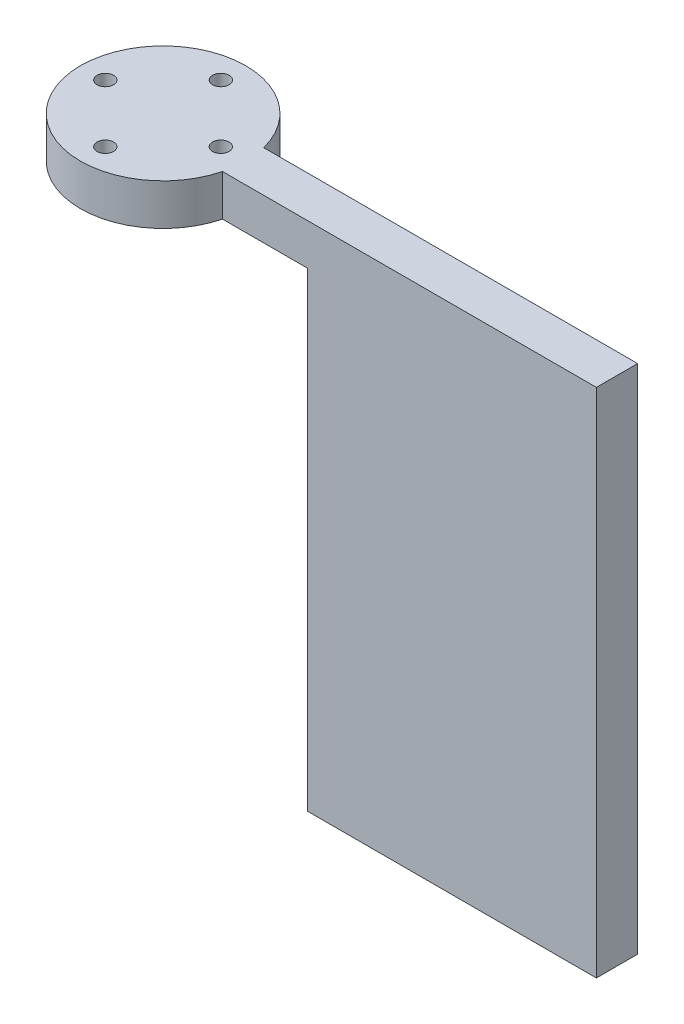
ISO-10303-21;
HEADER;
FILE_DESCRIPTION(('STEP AP214'),'2;1');
FILE_NAME('part.step','',(''),(''),'','','');
FILE_SCHEMA(('AUTOMOTIVE_DESIGN { 1 0 10303 214 1 1 1 1 }'));
ENDSEC;
DATA;
#1=APPLICATION_CONTEXT('core data for automotive mechanical design processes');
#2=APPLICATION_PROTOCOL_DEFINITION('international standard','automotive_design',2000,#1);
#3=PRODUCT_CONTEXT('',#1,'mechanical');
#4=PRODUCT('Part','Part','',(#3));
#5=PRODUCT_RELATED_PRODUCT_CATEGORY('part','',(#4));
#6=PRODUCT_DEFINITION_FORMATION('','',#4);
#7=PRODUCT_DEFINITION_CONTEXT('part definition',#1,'design');
#8=PRODUCT_DEFINITION('design','',#6,#7);
#9=PRODUCT_DEFINITION_SHAPE('','',#8);
#10=(LENGTH_UNIT() NAMED_UNIT(*) SI_UNIT(.MILLI.,.METRE.));
#11=(NAMED_UNIT(*) PLANE_ANGLE_UNIT() SI_UNIT($,.RADIAN.));
#12=(NAMED_UNIT(*) SI_UNIT($,.STERADIAN.) SOLID_ANGLE_UNIT());
#13=UNCERTAINTY_MEASURE_WITH_UNIT(LENGTH_MEASURE(1.E-05),#10,'distance_accuracy_value','');
#14=(GEOMETRIC_REPRESENTATION_CONTEXT(3) GLOBAL_UNCERTAINTY_ASSIGNED_CONTEXT((#13)) GLOBAL_UNIT_ASSIGNED_CONTEXT((#10,
#11,#12)) REPRESENTATION_CONTEXT('',''));
#15=CARTESIAN_POINT('',(0.,0.,0.));
#16=DIRECTION('',(0.,0.,1.));
#17=DIRECTION('',(1.,0.,0.));
#18=AXIS2_PLACEMENT_3D('',#15,#16,#17);
#19=CARTESIAN_POINT('',(0.,0.,-2.5));
#20=DIRECTION('',(0.,1.,0.));
#21=DIRECTION('',(0.,0.,-1.));
#22=AXIS2_PLACEMENT_3D('',#19,#20,#21);
#23=PLANE('',#22);
#24=DIRECTION('',(1.,0.,0.));
#25=VECTOR('',#24,1.);
#26=CARTESIAN_POINT('',(0.,0.,2.5));
#27=LINE('',#26,#25);
#28=CARTESIAN_POINT('',(0.,0.,2.5));
#29=VERTEX_POINT('',#28);
#30=CARTESIAN_POINT('',(35.,0.,2.5));
#31=VERTEX_POINT('',#30);
#32=EDGE_CURVE('E146',#29,#31,#27,.T.);
#33=ORIENTED_EDGE('',*,*,#32,.F.);
#34=DIRECTION('',(0.,0.,1.));
#35=VECTOR('',#34,1.);
#36=CARTESIAN_POINT('',(0.,0.,-2.5));
#37=LINE('',#36,#35);
#38=CARTESIAN_POINT('',(0.,0.,-2.5));
#39=VERTEX_POINT('',#38);
#40=EDGE_CURVE('E156',#39,#29,#37,.T.);
#41=ORIENTED_EDGE('',*,*,#40,.F.);
#42=DIRECTION('',(1.,0.,0.));
#43=VECTOR('',#42,1.);
#44=CARTESIAN_POINT('',(0.,0.,-2.5));
#45=LINE('',#44,#43);
#46=CARTESIAN_POINT('',(35.,0.,-2.5));
#47=VERTEX_POINT('',#46);
#48=EDGE_CURVE('E147',#39,#47,#45,.T.);
#49=ORIENTED_EDGE('',*,*,#48,.T.);
#50=DIRECTION('',(0.,0.,1.));
#51=VECTOR('',#50,1.);
#52=CARTESIAN_POINT('',(35.,0.,-2.5));
#53=LINE('',#52,#51);
#54=EDGE_CURVE('E11',#47,#31,#53,.T.);
#55=ORIENTED_EDGE('',*,*,#54,.T.);
#56=EDGE_LOOP('',(#33,#41,#49,#55));
#57=FACE_BOUND('',#56,.T.);
#58=ADVANCED_FACE('F45',(#57),#23,.F.);
#59=CARTESIAN_POINT('',(35.,0.,-2.5));
#60=DIRECTION('',(-1.,0.,0.));
#61=DIRECTION('',(0.,0.,-1.));
#62=AXIS2_PLACEMENT_3D('',#59,#60,#61);
#63=PLANE('',#62);
#64=DIRECTION('',(0.,1.,0.));
#65=VECTOR('',#64,1.);
#66=CARTESIAN_POINT('',(35.,0.,2.5));
#67=LINE('',#66,#65);
#68=CARTESIAN_POINT('',(35.,62.,2.5));
#69=VERTEX_POINT('',#68);
#70=EDGE_CURVE('E158',#31,#69,#67,.T.);
#71=ORIENTED_EDGE('',*,*,#70,.F.);
#72=ORIENTED_EDGE('',*,*,#54,.F.);
#73=DIRECTION('',(0.,1.,0.));
#74=VECTOR('',#73,1.);
#75=CARTESIAN_POINT('',(35.,0.,-2.5));
#76=LINE('',#75,#74);
#77=CARTESIAN_POINT('',(35.,62.,-2.5));
#78=VERTEX_POINT('',#77);
#79=EDGE_CURVE('E86',#47,#78,#76,.T.);
#80=ORIENTED_EDGE('',*,*,#79,.T.);
#81=DIRECTION('',(0.,0.,1.));
#82=VECTOR('',#81,1.);
#83=CARTESIAN_POINT('',(35.,62.,-2.5));
#84=LINE('',#83,#82);
#85=EDGE_CURVE('E53',#78,#69,#84,.T.);
#86=ORIENTED_EDGE('',*,*,#85,.T.);
#87=EDGE_LOOP('',(#71,#72,#80,#86));
#88=FACE_BOUND('',#87,.T.);
#89=ADVANCED_FACE('F166',(#88),#63,.F.);
#90=CARTESIAN_POINT('',(0.,62.,-2.5));
#91=DIRECTION('',(0.,1.,0.));
#92=DIRECTION('',(0.,0.,-1.));
#93=AXIS2_PLACEMENT_3D('',#90,#91,#92);
#94=PLANE('',#93);
#95=DIRECTION('',(1.,0.,0.));
#96=VECTOR('',#95,1.);
#97=CARTESIAN_POINT('',(0.,62.,2.5));
#98=LINE('',#97,#96);
#99=CARTESIAN_POINT('',(-10.316887097431,62.,2.5));
#100=VERTEX_POINT('',#99);
#101=EDGE_CURVE('E106',#100,#69,#98,.T.);
#102=ORIENTED_EDGE('',*,*,#101,.T.);
#103=ORIENTED_EDGE('',*,*,#85,.F.);
#104=DIRECTION('',(1.,0.,0.));
#105=VECTOR('',#104,1.);
#106=CARTESIAN_POINT('',(0.,62.,-2.5));
#107=LINE('',#106,#105);
#108=CARTESIAN_POINT('',(-10.316887097431,62.,-2.5));
#109=VERTEX_POINT('',#108);
#110=EDGE_CURVE('E151',#109,#78,#107,.T.);
#111=ORIENTED_EDGE('',*,*,#110,.F.);
#112=CARTESIAN_POINT('',(-20.02,62.,0.));
#113=DIRECTION('',(0.,-1.,0.));
#114=DIRECTION('',(0.,0.,-1.));
#115=AXIS2_PLACEMENT_3D('',#112,#113,#114);
#116=CIRCLE('',#115,10.02);
#117=EDGE_CURVE('E142',#100,#109,#116,.T.);
#118=ORIENTED_EDGE('',*,*,#117,.F.);
#119=EDGE_LOOP('',(#102,#103,#111,#118));
#120=FACE_BOUND('',#119,.T.);
#121=CARTESIAN_POINT('',(-13.02,62.,0.));
#122=DIRECTION('',(0.,-1.,0.));
#123=DIRECTION('',(0.,0.,-1.));
#124=AXIS2_PLACEMENT_3D('',#121,#122,#123);
#125=CIRCLE('',#124,1.);
#126=CARTESIAN_POINT('',(-13.02,62.,-1.));
#127=VERTEX_POINT('',#126);
#128=EDGE_CURVE('E130',#127,#127,#125,.T.);
#129=ORIENTED_EDGE('',*,*,#128,.T.);
#130=EDGE_LOOP('',(#129));
#131=FACE_BOUND('',#130,.T.);
#132=CARTESIAN_POINT('',(-20.02,62.,-7.));
#133=DIRECTION('',(0.,-1.,0.));
#134=DIRECTION('',(0.,0.,-1.));
#135=AXIS2_PLACEMENT_3D('',#132,#133,#134);
#136=CIRCLE('',#135,1.);
#137=CARTESIAN_POINT('',(-20.02,62.,-8.));
#138=VERTEX_POINT('',#137);
#139=EDGE_CURVE('E133',#138,#138,#136,.T.);
#140=ORIENTED_EDGE('',*,*,#139,.T.);
#141=EDGE_LOOP('',(#140));
#142=FACE_BOUND('',#141,.T.);
#143=CARTESIAN_POINT('',(-27.02,62.,0.));
#144=DIRECTION('',(0.,-1.,0.));
#145=DIRECTION('',(0.,0.,-1.));
#146=AXIS2_PLACEMENT_3D('',#143,#144,#145);
#147=CIRCLE('',#146,0.999999999999998);
#148=CARTESIAN_POINT('',(-27.02,62.,-0.999999999999998));
#149=VERTEX_POINT('',#148);
#150=EDGE_CURVE('E136',#149,#149,#147,.T.);
#151=ORIENTED_EDGE('',*,*,#150,.T.);
#152=EDGE_LOOP('',(#151));
#153=FACE_BOUND('',#152,.T.);
#154=CARTESIAN_POINT('',(-20.02,62.,7.));
#155=DIRECTION('',(0.,-1.,0.));
#156=DIRECTION('',(0.,0.,-1.));
#157=AXIS2_PLACEMENT_3D('',#154,#155,#156);
#158=CIRCLE('',#157,1.);
#159=CARTESIAN_POINT('',(-20.02,62.,6.));
#160=VERTEX_POINT('',#159);
#161=EDGE_CURVE('E139',#160,#160,#158,.T.);
#162=ORIENTED_EDGE('',*,*,#161,.T.);
#163=EDGE_LOOP('',(#162));
#164=FACE_BOUND('',#163,.T.);
#165=ADVANCED_FACE('F181',(#120,#131,#142,#153,#164),#94,.T.);
#166=CARTESIAN_POINT('',(0.,57.,-2.5));
#167=DIRECTION('',(0.,-1.,0.));
#168=DIRECTION('',(0.,0.,1.));
#169=AXIS2_PLACEMENT_3D('',#166,#167,#168);
#170=PLANE('',#169);
#171=CARTESIAN_POINT('',(-20.02,57.,0.));
#172=DIRECTION('',(0.,-1.,0.));
#173=DIRECTION('',(0.,0.,-1.));
#174=AXIS2_PLACEMENT_3D('',#171,#172,#173);
#175=CIRCLE('',#174,10.02);
#176=CARTESIAN_POINT('',(-10.316887097431,57.,2.5));
#177=VERTEX_POINT('',#176);
#178=CARTESIAN_POINT('',(-10.316887097431,57.,-2.5));
#179=VERTEX_POINT('',#178);
#180=EDGE_CURVE('E112',#177,#179,#175,.T.);
#181=ORIENTED_EDGE('',*,*,#180,.T.);
#182=DIRECTION('',(-1.,0.,0.));
#183=VECTOR('',#182,1.);
#184=CARTESIAN_POINT('',(0.,57.,-2.5));
#185=LINE('',#184,#183);
#186=CARTESIAN_POINT('',(0.,57.,-2.5));
#187=VERTEX_POINT('',#186);
#188=EDGE_CURVE('E153',#187,#179,#185,.T.);
#189=ORIENTED_EDGE('',*,*,#188,.F.);
#190=DIRECTION('',(0.,0.,1.));
#191=VECTOR('',#190,1.);
#192=CARTESIAN_POINT('',(0.,57.,-2.5));
#193=LINE('',#192,#191);
#194=CARTESIAN_POINT('',(0.,57.,2.5));
#195=VERTEX_POINT('',#194);
#196=EDGE_CURVE('E119',#187,#195,#193,.T.);
#197=ORIENTED_EDGE('',*,*,#196,.T.);
#198=DIRECTION('',(-1.,0.,0.));
#199=VECTOR('',#198,1.);
#200=CARTESIAN_POINT('',(0.,57.,2.5));
#201=LINE('',#200,#199);
#202=EDGE_CURVE('E103',#195,#177,#201,.T.);
#203=ORIENTED_EDGE('',*,*,#202,.T.);
#204=EDGE_LOOP('',(#181,#189,#197,#203));
#205=FACE_BOUND('',#204,.T.);
#206=CARTESIAN_POINT('',(-13.02,57.,0.));
#207=DIRECTION('',(0.,-1.,0.));
#208=DIRECTION('',(0.,0.,-1.));
#209=AXIS2_PLACEMENT_3D('',#206,#207,#208);
#210=CIRCLE('',#209,1.);
#211=CARTESIAN_POINT('',(-13.02,57.,-1.));
#212=VERTEX_POINT('',#211);
#213=EDGE_CURVE('E143',#212,#212,#210,.T.);
#214=ORIENTED_EDGE('',*,*,#213,.F.);
#215=EDGE_LOOP('',(#214));
#216=FACE_BOUND('',#215,.T.);
#217=CARTESIAN_POINT('',(-20.02,57.,-7.));
#218=DIRECTION('',(0.,-1.,0.));
#219=DIRECTION('',(0.,0.,-1.));
#220=AXIS2_PLACEMENT_3D('',#217,#218,#219);
#221=CIRCLE('',#220,1.);
#222=CARTESIAN_POINT('',(-20.02,57.,-8.));
#223=VERTEX_POINT('',#222);
#224=EDGE_CURVE('E325',#223,#223,#221,.T.);
#225=ORIENTED_EDGE('',*,*,#224,.F.);
#226=EDGE_LOOP('',(#225));
#227=FACE_BOUND('',#226,.T.);
#228=CARTESIAN_POINT('',(-27.02,57.,0.));
#229=DIRECTION('',(0.,-1.,0.));
#230=DIRECTION('',(0.,0.,-1.));
#231=AXIS2_PLACEMENT_3D('',#228,#229,#230);
#232=CIRCLE('',#231,0.999999999999998);
#233=CARTESIAN_POINT('',(-27.02,57.,-0.999999999999998));
#234=VERTEX_POINT('',#233);
#235=EDGE_CURVE('E126',#234,#234,#232,.T.);
#236=ORIENTED_EDGE('',*,*,#235,.F.);
#237=EDGE_LOOP('',(#236));
#238=FACE_BOUND('',#237,.T.);
#239=CARTESIAN_POINT('',(-20.02,57.,7.));
#240=DIRECTION('',(0.,-1.,0.));
#241=DIRECTION('',(0.,0.,-1.));
#242=AXIS2_PLACEMENT_3D('',#239,#240,#241);
#243=CIRCLE('',#242,1.);
#244=CARTESIAN_POINT('',(-20.02,57.,6.));
#245=VERTEX_POINT('',#244);
#246=EDGE_CURVE('E123',#245,#245,#243,.T.);
#247=ORIENTED_EDGE('',*,*,#246,.F.);
#248=EDGE_LOOP('',(#247));
#249=FACE_BOUND('',#248,.T.);
#250=ADVANCED_FACE('F116',(#205,#216,#227,#238,#249),#170,.T.);
#251=CARTESIAN_POINT('',(0.,0.,-2.5));
#252=DIRECTION('',(-1.,0.,0.));
#253=DIRECTION('',(0.,0.,-1.));
#254=AXIS2_PLACEMENT_3D('',#251,#252,#253);
#255=PLANE('',#254);
#256=DIRECTION('',(0.,1.,0.));
#257=VECTOR('',#256,1.);
#258=CARTESIAN_POINT('',(0.,0.,2.5));
#259=LINE('',#258,#257);
#260=EDGE_CURVE('E76',#29,#195,#259,.T.);
#261=ORIENTED_EDGE('',*,*,#260,.T.);
#262=ORIENTED_EDGE('',*,*,#196,.F.);
#263=DIRECTION('',(0.,1.,0.));
#264=VECTOR('',#263,1.);
#265=CARTESIAN_POINT('',(0.,0.,-2.5));
#266=LINE('',#265,#264);
#267=EDGE_CURVE('E61',#39,#187,#266,.T.);
#268=ORIENTED_EDGE('',*,*,#267,.F.);
#269=ORIENTED_EDGE('',*,*,#40,.T.);
#270=EDGE_LOOP('',(#261,#262,#268,#269));
#271=FACE_BOUND('',#270,.T.);
#272=ADVANCED_FACE('F173',(#271),#255,.T.);
#273=CARTESIAN_POINT('',(0.,0.,-2.5));
#274=DIRECTION('',(0.,0.,-1.));
#275=DIRECTION('',(1.,0.,0.));
#276=AXIS2_PLACEMENT_3D('',#273,#274,#275);
#277=PLANE('',#276);
#278=ORIENTED_EDGE('',*,*,#48,.F.);
#279=ORIENTED_EDGE('',*,*,#267,.T.);
#280=ORIENTED_EDGE('',*,*,#188,.T.);
#281=DIRECTION('',(0.,1.,0.));
#282=VECTOR('',#281,1.);
#283=CARTESIAN_POINT('',(-10.316887097431,57.,-2.5));
#284=LINE('',#283,#282);
#285=EDGE_CURVE('E111',#179,#109,#284,.T.);
#286=ORIENTED_EDGE('',*,*,#285,.T.);
#287=ORIENTED_EDGE('',*,*,#110,.T.);
#288=ORIENTED_EDGE('',*,*,#79,.F.);
#289=EDGE_LOOP('',(#278,#279,#280,#286,#287,#288));
#290=FACE_BOUND('',#289,.T.);
#291=ADVANCED_FACE('F172',(#290),#277,.T.);
#292=CARTESIAN_POINT('',(0.,0.,2.5));
#293=DIRECTION('',(0.,0.,-1.));
#294=DIRECTION('',(1.,0.,0.));
#295=AXIS2_PLACEMENT_3D('',#292,#293,#294);
#296=PLANE('',#295);
#297=ORIENTED_EDGE('',*,*,#32,.T.);
#298=ORIENTED_EDGE('',*,*,#70,.T.);
#299=ORIENTED_EDGE('',*,*,#101,.F.);
#300=DIRECTION('',(0.,1.,0.));
#301=VECTOR('',#300,1.);
#302=CARTESIAN_POINT('',(-10.316887097431,57.,2.5));
#303=LINE('',#302,#301);
#304=EDGE_CURVE('E100',#177,#100,#303,.T.);
#305=ORIENTED_EDGE('',*,*,#304,.F.);
#306=ORIENTED_EDGE('',*,*,#202,.F.);
#307=ORIENTED_EDGE('',*,*,#260,.F.);
#308=EDGE_LOOP('',(#297,#298,#299,#305,#306,#307));
#309=FACE_BOUND('',#308,.T.);
#310=ADVANCED_FACE('F102',(#309),#296,.F.);
#311=CARTESIAN_POINT('',(-20.02,57.,0.));
#312=DIRECTION('',(0.,1.,0.));
#313=DIRECTION('',(0.,0.,-1.));
#314=AXIS2_PLACEMENT_3D('',#311,#312,#313);
#315=CYLINDRICAL_SURFACE('',#314,10.02);
#316=ORIENTED_EDGE('',*,*,#180,.F.);
#317=ORIENTED_EDGE('',*,*,#304,.T.);
#318=ORIENTED_EDGE('',*,*,#117,.T.);
#319=ORIENTED_EDGE('',*,*,#285,.F.);
#320=EDGE_LOOP('',(#316,#317,#318,#319));
#321=FACE_BOUND('',#320,.T.);
#322=ADVANCED_FACE('F121',(#321),#315,.T.);
#323=CARTESIAN_POINT('',(-20.02,57.,7.));
#324=DIRECTION('',(0.,1.,0.));
#325=DIRECTION('',(0.,0.,-1.));
#326=AXIS2_PLACEMENT_3D('',#323,#324,#325);
#327=CYLINDRICAL_SURFACE('',#326,1.);
#328=ORIENTED_EDGE('',*,*,#246,.T.);
#329=EDGE_LOOP('',(#328));
#330=FACE_BOUND('',#329,.T.);
#331=ORIENTED_EDGE('',*,*,#161,.F.);
#332=EDGE_LOOP('',(#331));
#333=FACE_BOUND('',#332,.T.);
#334=ADVANCED_FACE('F203',(#330,#333),#327,.F.);
#335=CARTESIAN_POINT('',(-27.02,57.,0.));
#336=DIRECTION('',(0.,1.,0.));
#337=DIRECTION('',(0.,0.,-1.));
#338=AXIS2_PLACEMENT_3D('',#335,#336,#337);
#339=CYLINDRICAL_SURFACE('',#338,0.999999999999998);
#340=ORIENTED_EDGE('',*,*,#235,.T.);
#341=EDGE_LOOP('',(#340));
#342=FACE_BOUND('',#341,.T.);
#343=ORIENTED_EDGE('',*,*,#150,.F.);
#344=EDGE_LOOP('',(#343));
#345=FACE_BOUND('',#344,.T.);
#346=ADVANCED_FACE('F205',(#342,#345),#339,.F.);
#347=CARTESIAN_POINT('',(-20.02,57.,-7.));
#348=DIRECTION('',(0.,1.,0.));
#349=DIRECTION('',(0.,0.,-1.));
#350=AXIS2_PLACEMENT_3D('',#347,#348,#349);
#351=CYLINDRICAL_SURFACE('',#350,1.);
#352=ORIENTED_EDGE('',*,*,#224,.T.);
#353=EDGE_LOOP('',(#352));
#354=FACE_BOUND('',#353,.T.);
#355=ORIENTED_EDGE('',*,*,#139,.F.);
#356=EDGE_LOOP('',(#355));
#357=FACE_BOUND('',#356,.T.);
#358=ADVANCED_FACE('F212',(#354,#357),#351,.F.);
#359=CARTESIAN_POINT('',(-13.02,57.,0.));
#360=DIRECTION('',(0.,1.,0.));
#361=DIRECTION('',(0.,0.,-1.));
#362=AXIS2_PLACEMENT_3D('',#359,#360,#361);
#363=CYLINDRICAL_SURFACE('',#362,1.);
#364=ORIENTED_EDGE('',*,*,#213,.T.);
#365=EDGE_LOOP('',(#364));
#366=FACE_BOUND('',#365,.T.);
#367=ORIENTED_EDGE('',*,*,#128,.F.);
#368=EDGE_LOOP('',(#367));
#369=FACE_BOUND('',#368,.T.);
#370=ADVANCED_FACE('F219',(#366,#369),#363,.F.);
#371=CLOSED_SHELL('',(#58,#89,#165,#250,#272,#291,#310,#322,#334,#346,#358,#370));
#372=MANIFOLD_SOLID_BREP('B2',#371);
#373=ADVANCED_BREP_SHAPE_REPRESENTATION('',(#18,#372),#14);
#374=SHAPE_DEFINITION_REPRESENTATION(#9,#373);
ENDSEC;
END-ISO-10303-21;
